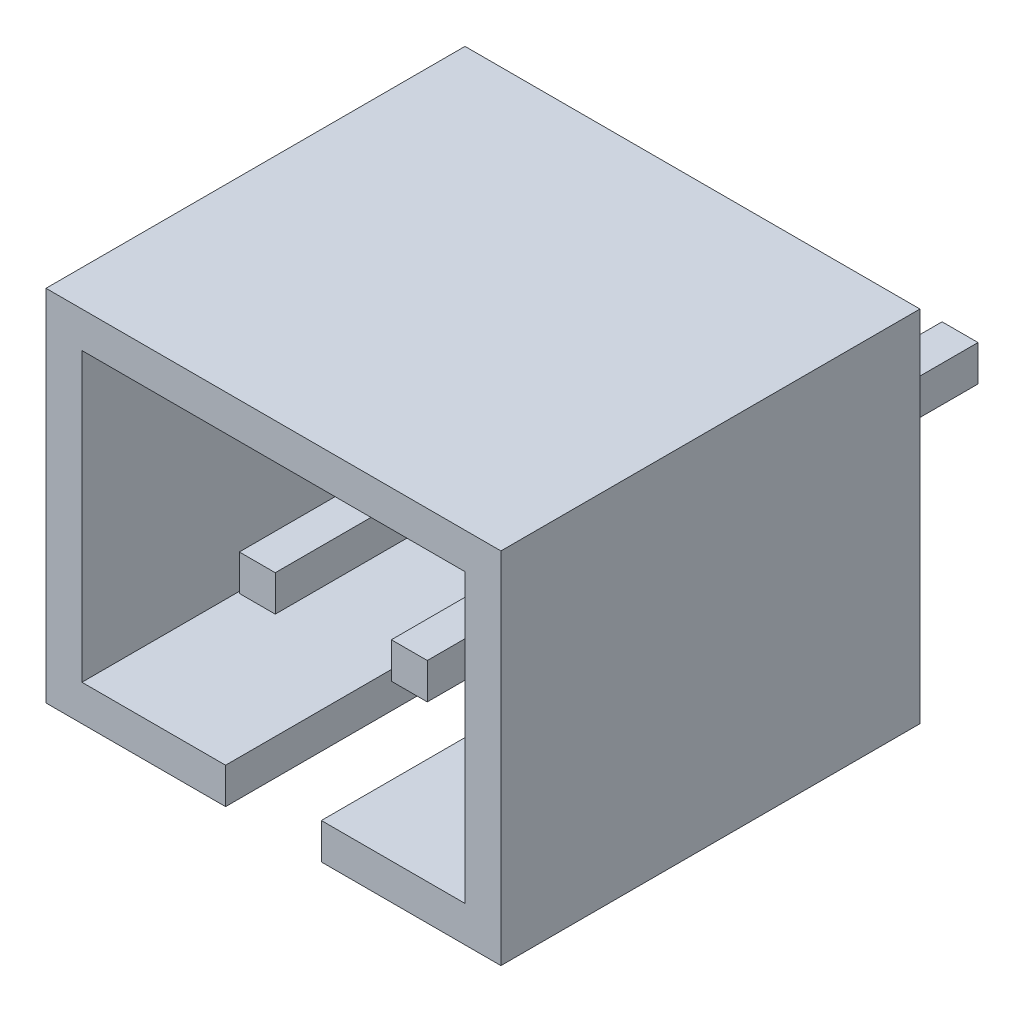
ISO-10303-21;
HEADER;
FILE_DESCRIPTION(('STEP AP214'),'2;1');
FILE_NAME('part.step','',(''),(''),'','','');
FILE_SCHEMA(('AUTOMOTIVE_DESIGN { 1 0 10303 214 1 1 1 1 }'));
ENDSEC;
DATA;
#1=APPLICATION_CONTEXT('core data for automotive mechanical design processes');
#2=APPLICATION_PROTOCOL_DEFINITION('international standard','automotive_design',2000,#1);
#3=PRODUCT_CONTEXT('',#1,'mechanical');
#4=PRODUCT('Part','Part','',(#3));
#5=PRODUCT_RELATED_PRODUCT_CATEGORY('part','',(#4));
#6=PRODUCT_DEFINITION_FORMATION('','',#4);
#7=PRODUCT_DEFINITION_CONTEXT('part definition',#1,'design');
#8=PRODUCT_DEFINITION('design','',#6,#7);
#9=PRODUCT_DEFINITION_SHAPE('','',#8);
#10=(LENGTH_UNIT() NAMED_UNIT(*) SI_UNIT(.MILLI.,.METRE.));
#11=(NAMED_UNIT(*) PLANE_ANGLE_UNIT() SI_UNIT($,.RADIAN.));
#12=(NAMED_UNIT(*) SI_UNIT($,.STERADIAN.) SOLID_ANGLE_UNIT());
#13=UNCERTAINTY_MEASURE_WITH_UNIT(LENGTH_MEASURE(1.E-05),#10,'distance_accuracy_value','');
#14=(GEOMETRIC_REPRESENTATION_CONTEXT(3) GLOBAL_UNCERTAINTY_ASSIGNED_CONTEXT((#13)) GLOBAL_UNIT_ASSIGNED_CONTEXT((#10,
#11,#12)) REPRESENTATION_CONTEXT('',''));
#15=CARTESIAN_POINT('',(0.,0.,0.));
#16=DIRECTION('',(0.,0.,1.));
#17=DIRECTION('',(1.,0.,0.));
#18=AXIS2_PLACEMENT_3D('',#15,#16,#17);
#19=CARTESIAN_POINT('',(3.8,3.,1.8));
#20=DIRECTION('',(-1.,0.,0.));
#21=DIRECTION('',(0.,-1.,0.));
#22=AXIS2_PLACEMENT_3D('',#19,#20,#21);
#23=PLANE('',#22);
#24=DIRECTION('',(0.,1.,0.));
#25=VECTOR('',#24,1.);
#26=CARTESIAN_POINT('',(3.8,3.,0.));
#27=LINE('',#26,#25);
#28=CARTESIAN_POINT('',(3.8,-3.,0.));
#29=VERTEX_POINT('',#28);
#30=CARTESIAN_POINT('',(3.8,3.,0.));
#31=VERTEX_POINT('',#30);
#32=EDGE_CURVE('E359',#29,#31,#27,.T.);
#33=ORIENTED_EDGE('',*,*,#32,.T.);
#34=DIRECTION('',(0.,0.,-1.));
#35=VECTOR('',#34,1.);
#36=CARTESIAN_POINT('',(3.8,3.,1.8));
#37=LINE('',#36,#35);
#38=CARTESIAN_POINT('',(3.8,3.,7.));
#39=VERTEX_POINT('',#38);
#40=EDGE_CURVE('E428',#39,#31,#37,.T.);
#41=ORIENTED_EDGE('',*,*,#40,.F.);
#42=DIRECTION('',(0.,1.,0.));
#43=VECTOR('',#42,1.);
#44=CARTESIAN_POINT('',(3.8,-3.,7.));
#45=LINE('',#44,#43);
#46=CARTESIAN_POINT('',(3.8,-3.,7.));
#47=VERTEX_POINT('',#46);
#48=EDGE_CURVE('E360',#47,#39,#45,.T.);
#49=ORIENTED_EDGE('',*,*,#48,.F.);
#50=DIRECTION('',(0.,0.,-1.));
#51=VECTOR('',#50,1.);
#52=CARTESIAN_POINT('',(3.8,-3.,1.8));
#53=LINE('',#52,#51);
#54=EDGE_CURVE('E411',#47,#29,#53,.T.);
#55=ORIENTED_EDGE('',*,*,#54,.T.);
#56=EDGE_LOOP('',(#33,#41,#49,#55));
#57=FACE_BOUND('',#56,.T.);
#58=ADVANCED_FACE('F37',(#57),#23,.F.);
#59=CARTESIAN_POINT('',(-3.8,3.,1.8));
#60=DIRECTION('',(0.,-1.,0.));
#61=DIRECTION('',(0.,0.,-1.));
#62=AXIS2_PLACEMENT_3D('',#59,#60,#61);
#63=PLANE('',#62);
#64=DIRECTION('',(-1.,0.,0.));
#65=VECTOR('',#64,1.);
#66=CARTESIAN_POINT('',(-3.8,3.,0.));
#67=LINE('',#66,#65);
#68=CARTESIAN_POINT('',(-3.8,3.,0.));
#69=VERTEX_POINT('',#68);
#70=EDGE_CURVE('E415',#31,#69,#67,.T.);
#71=ORIENTED_EDGE('',*,*,#70,.T.);
#72=DIRECTION('',(0.,0.,-1.));
#73=VECTOR('',#72,1.);
#74=CARTESIAN_POINT('',(-3.8,3.,1.8));
#75=LINE('',#74,#73);
#76=CARTESIAN_POINT('',(-3.8,3.,7.));
#77=VERTEX_POINT('',#76);
#78=EDGE_CURVE('E425',#77,#69,#75,.T.);
#79=ORIENTED_EDGE('',*,*,#78,.F.);
#80=DIRECTION('',(-1.,0.,0.));
#81=VECTOR('',#80,1.);
#82=CARTESIAN_POINT('',(-3.8,3.,7.));
#83=LINE('',#82,#81);
#84=EDGE_CURVE('E356',#39,#77,#83,.T.);
#85=ORIENTED_EDGE('',*,*,#84,.F.);
#86=ORIENTED_EDGE('',*,*,#40,.T.);
#87=EDGE_LOOP('',(#71,#79,#85,#86));
#88=FACE_BOUND('',#87,.T.);
#89=ADVANCED_FACE('F481',(#88),#63,.F.);
#90=CARTESIAN_POINT('',(-3.8,3.,1.8));
#91=DIRECTION('',(1.,0.,0.));
#92=DIRECTION('',(0.,1.,0.));
#93=AXIS2_PLACEMENT_3D('',#90,#91,#92);
#94=PLANE('',#93);
#95=DIRECTION('',(0.,-1.,0.));
#96=VECTOR('',#95,1.);
#97=CARTESIAN_POINT('',(-3.8,3.,0.));
#98=LINE('',#97,#96);
#99=CARTESIAN_POINT('',(-3.8,-3.,0.));
#100=VERTEX_POINT('',#99);
#101=EDGE_CURVE('E417',#69,#100,#98,.T.);
#102=ORIENTED_EDGE('',*,*,#101,.T.);
#103=DIRECTION('',(0.,0.,-1.));
#104=VECTOR('',#103,1.);
#105=CARTESIAN_POINT('',(-3.8,-3.,1.8));
#106=LINE('',#105,#104);
#107=CARTESIAN_POINT('',(-3.8,-3.,7.));
#108=VERTEX_POINT('',#107);
#109=EDGE_CURVE('E422',#108,#100,#106,.T.);
#110=ORIENTED_EDGE('',*,*,#109,.F.);
#111=DIRECTION('',(0.,-1.,0.));
#112=VECTOR('',#111,1.);
#113=CARTESIAN_POINT('',(-3.8,-3.,7.));
#114=LINE('',#113,#112);
#115=EDGE_CURVE('E390',#77,#108,#114,.T.);
#116=ORIENTED_EDGE('',*,*,#115,.F.);
#117=ORIENTED_EDGE('',*,*,#78,.T.);
#118=EDGE_LOOP('',(#102,#110,#116,#117));
#119=FACE_BOUND('',#118,.T.);
#120=ADVANCED_FACE('F486',(#119),#94,.F.);
#121=CARTESIAN_POINT('',(-3.8,-3.,1.8));
#122=DIRECTION('',(0.,1.,0.));
#123=DIRECTION('',(0.,0.,1.));
#124=AXIS2_PLACEMENT_3D('',#121,#122,#123);
#125=PLANE('',#124);
#126=DIRECTION('',(1.,0.,0.));
#127=VECTOR('',#126,1.);
#128=CARTESIAN_POINT('',(-3.8,-3.,0.));
#129=LINE('',#128,#127);
#130=EDGE_CURVE('E412',#100,#29,#129,.T.);
#131=ORIENTED_EDGE('',*,*,#130,.T.);
#132=ORIENTED_EDGE('',*,*,#54,.F.);
#133=DIRECTION('',(1.,0.,0.));
#134=VECTOR('',#133,1.);
#135=CARTESIAN_POINT('',(0.800000000000001,-3.,7.));
#136=LINE('',#135,#134);
#137=CARTESIAN_POINT('',(0.800000000000001,-3.,7.));
#138=VERTEX_POINT('',#137);
#139=EDGE_CURVE('E363',#138,#47,#136,.T.);
#140=ORIENTED_EDGE('',*,*,#139,.F.);
#141=DIRECTION('',(0.,0.,-1.));
#142=VECTOR('',#141,1.);
#143=CARTESIAN_POINT('',(0.800000000000001,-3.,23.6829747495282));
#144=LINE('',#143,#142);
#145=CARTESIAN_POINT('',(0.799999999999999,-3.,1.8));
#146=VERTEX_POINT('',#145);
#147=EDGE_CURVE('E331',#138,#146,#144,.T.);
#148=ORIENTED_EDGE('',*,*,#147,.T.);
#149=DIRECTION('',(1.,0.,0.));
#150=VECTOR('',#149,1.);
#151=CARTESIAN_POINT('',(-3.8,-3.,1.8));
#152=LINE('',#151,#150);
#153=CARTESIAN_POINT('',(-0.8,-3.,1.8));
#154=VERTEX_POINT('',#153);
#155=EDGE_CURVE('E409',#154,#146,#152,.T.);
#156=ORIENTED_EDGE('',*,*,#155,.F.);
#157=DIRECTION('',(0.,0.,-1.));
#158=VECTOR('',#157,1.);
#159=CARTESIAN_POINT('',(-0.799999999999999,-3.,23.6829747495282));
#160=LINE('',#159,#158);
#161=CARTESIAN_POINT('',(-0.799999999999999,-3.,7.));
#162=VERTEX_POINT('',#161);
#163=EDGE_CURVE('E327',#162,#154,#160,.T.);
#164=ORIENTED_EDGE('',*,*,#163,.F.);
#165=DIRECTION('',(1.,0.,0.));
#166=VECTOR('',#165,1.);
#167=CARTESIAN_POINT('',(-0.799999999999999,-3.,7.));
#168=LINE('',#167,#166);
#169=EDGE_CURVE('E387',#108,#162,#168,.T.);
#170=ORIENTED_EDGE('',*,*,#169,.F.);
#171=ORIENTED_EDGE('',*,*,#109,.T.);
#172=EDGE_LOOP('',(#131,#132,#140,#148,#156,#164,#170,#171));
#173=FACE_BOUND('',#172,.T.);
#174=ADVANCED_FACE('F499',(#173),#125,.F.);
#175=CARTESIAN_POINT('',(0.,0.,1.8));
#176=DIRECTION('',(0.,0.,1.));
#177=DIRECTION('',(1.,0.,0.));
#178=AXIS2_PLACEMENT_3D('',#175,#176,#177);
#179=PLANE('',#178);
#180=DIRECTION('',(0.,-1.,0.));
#181=VECTOR('',#180,1.);
#182=CARTESIAN_POINT('',(0.97,0.,1.8));
#183=LINE('',#182,#181);
#184=CARTESIAN_POINT('',(0.97,-0.2,1.8));
#185=VERTEX_POINT('',#184);
#186=CARTESIAN_POINT('',(0.97,-0.8,1.8));
#187=VERTEX_POINT('',#186);
#188=EDGE_CURVE('E51',#185,#187,#183,.T.);
#189=ORIENTED_EDGE('',*,*,#188,.F.);
#190=DIRECTION('',(-1.,0.,0.));
#191=VECTOR('',#190,1.);
#192=CARTESIAN_POINT('',(0.,-0.2,1.8));
#193=LINE('',#192,#191);
#194=CARTESIAN_POINT('',(1.57,-0.2,1.8));
#195=VERTEX_POINT('',#194);
#196=EDGE_CURVE('E55',#195,#185,#193,.T.);
#197=ORIENTED_EDGE('',*,*,#196,.F.);
#198=DIRECTION('',(0.,1.,0.));
#199=VECTOR('',#198,1.);
#200=CARTESIAN_POINT('',(1.57,0.,1.8));
#201=LINE('',#200,#199);
#202=CARTESIAN_POINT('',(1.57,-0.8,1.8));
#203=VERTEX_POINT('',#202);
#204=EDGE_CURVE('E226',#203,#195,#201,.T.);
#205=ORIENTED_EDGE('',*,*,#204,.F.);
#206=DIRECTION('',(1.,0.,0.));
#207=VECTOR('',#206,1.);
#208=CARTESIAN_POINT('',(0.,-0.8,1.8));
#209=LINE('',#208,#207);
#210=EDGE_CURVE('E263',#187,#203,#209,.T.);
#211=ORIENTED_EDGE('',*,*,#210,.F.);
#212=EDGE_LOOP('',(#189,#197,#205,#211));
#213=FACE_BOUND('',#212,.T.);
#214=DIRECTION('',(0.,-1.,0.));
#215=VECTOR('',#214,1.);
#216=CARTESIAN_POINT('',(-1.57,0.,1.8));
#217=LINE('',#216,#215);
#218=CARTESIAN_POINT('',(-1.57,-0.2,1.8));
#219=VERTEX_POINT('',#218);
#220=CARTESIAN_POINT('',(-1.57,-0.8,1.8));
#221=VERTEX_POINT('',#220);
#222=EDGE_CURVE('E324',#219,#221,#217,.T.);
#223=ORIENTED_EDGE('',*,*,#222,.F.);
#224=DIRECTION('',(-1.,0.,0.));
#225=VECTOR('',#224,1.);
#226=CARTESIAN_POINT('',(0.,-0.2,1.8));
#227=LINE('',#226,#225);
#228=CARTESIAN_POINT('',(-0.970000000000001,-0.2,1.8));
#229=VERTEX_POINT('',#228);
#230=EDGE_CURVE('E321',#229,#219,#227,.T.);
#231=ORIENTED_EDGE('',*,*,#230,.F.);
#232=DIRECTION('',(0.,1.,0.));
#233=VECTOR('',#232,1.);
#234=CARTESIAN_POINT('',(-0.970000000000001,0.,1.8));
#235=LINE('',#234,#233);
#236=CARTESIAN_POINT('',(-0.97,-0.8,1.8));
#237=VERTEX_POINT('',#236);
#238=EDGE_CURVE('E318',#237,#229,#235,.T.);
#239=ORIENTED_EDGE('',*,*,#238,.F.);
#240=DIRECTION('',(1.,0.,0.));
#241=VECTOR('',#240,1.);
#242=CARTESIAN_POINT('',(0.,-0.8,1.8));
#243=LINE('',#242,#241);
#244=EDGE_CURVE('E304',#221,#237,#243,.T.);
#245=ORIENTED_EDGE('',*,*,#244,.F.);
#246=EDGE_LOOP('',(#223,#231,#239,#245));
#247=FACE_BOUND('',#246,.T.);
#248=DIRECTION('',(0.,-1.,0.));
#249=VECTOR('',#248,1.);
#250=CARTESIAN_POINT('',(0.800000000000001,-3.,1.8));
#251=LINE('',#250,#249);
#252=CARTESIAN_POINT('',(0.800000000000001,-2.4,1.8));
#253=VERTEX_POINT('',#252);
#254=EDGE_CURVE('E328',#253,#146,#251,.T.);
#255=ORIENTED_EDGE('',*,*,#254,.F.);
#256=DIRECTION('',(-1.,0.,0.));
#257=VECTOR('',#256,1.);
#258=CARTESIAN_POINT('',(0.800000000000001,-2.4,1.8));
#259=LINE('',#258,#257);
#260=CARTESIAN_POINT('',(3.2,-2.4,1.8));
#261=VERTEX_POINT('',#260);
#262=EDGE_CURVE('E333',#261,#253,#259,.T.);
#263=ORIENTED_EDGE('',*,*,#262,.F.);
#264=DIRECTION('',(0.,-1.,0.));
#265=VECTOR('',#264,1.);
#266=CARTESIAN_POINT('',(3.2,-2.4,1.8));
#267=LINE('',#266,#265);
#268=CARTESIAN_POINT('',(3.2,2.4,1.8));
#269=VERTEX_POINT('',#268);
#270=EDGE_CURVE('E337',#269,#261,#267,.T.);
#271=ORIENTED_EDGE('',*,*,#270,.F.);
#272=DIRECTION('',(1.,0.,0.));
#273=VECTOR('',#272,1.);
#274=CARTESIAN_POINT('',(-3.2,2.4,1.8));
#275=LINE('',#274,#273);
#276=CARTESIAN_POINT('',(-3.2,2.4,1.8));
#277=VERTEX_POINT('',#276);
#278=EDGE_CURVE('E341',#277,#269,#275,.T.);
#279=ORIENTED_EDGE('',*,*,#278,.F.);
#280=DIRECTION('',(0.,1.,0.));
#281=VECTOR('',#280,1.);
#282=CARTESIAN_POINT('',(-3.2,-2.4,1.8));
#283=LINE('',#282,#281);
#284=CARTESIAN_POINT('',(-3.2,-2.4,1.8));
#285=VERTEX_POINT('',#284);
#286=EDGE_CURVE('E345',#285,#277,#283,.T.);
#287=ORIENTED_EDGE('',*,*,#286,.F.);
#288=DIRECTION('',(-1.,0.,0.));
#289=VECTOR('',#288,1.);
#290=CARTESIAN_POINT('',(-0.799999999999999,-2.4,1.8));
#291=LINE('',#290,#289);
#292=CARTESIAN_POINT('',(-0.799999999999999,-2.4,1.8));
#293=VERTEX_POINT('',#292);
#294=EDGE_CURVE('E349',#293,#285,#291,.T.);
#295=ORIENTED_EDGE('',*,*,#294,.F.);
#296=DIRECTION('',(0.,1.,0.));
#297=VECTOR('',#296,1.);
#298=CARTESIAN_POINT('',(-0.799999999999999,-3.,1.8));
#299=LINE('',#298,#297);
#300=EDGE_CURVE('E353',#154,#293,#299,.T.);
#301=ORIENTED_EDGE('',*,*,#300,.F.);
#302=ORIENTED_EDGE('',*,*,#155,.T.);
#303=EDGE_LOOP('',(#255,#263,#271,#279,#287,#295,#301,#302));
#304=FACE_BOUND('',#303,.T.);
#305=ADVANCED_FACE('F505',(#213,#247,#304),#179,.T.);
#306=CARTESIAN_POINT('',(0.,0.,0.));
#307=DIRECTION('',(0.,0.,1.));
#308=DIRECTION('',(1.,0.,0.));
#309=AXIS2_PLACEMENT_3D('',#306,#307,#308);
#310=PLANE('',#309);
#311=DIRECTION('',(-1.,0.,0.));
#312=VECTOR('',#311,1.);
#313=CARTESIAN_POINT('',(0.,-0.2,0.));
#314=LINE('',#313,#312);
#315=CARTESIAN_POINT('',(1.57,-0.2,0.));
#316=VERTEX_POINT('',#315);
#317=CARTESIAN_POINT('',(0.97,-0.2,0.));
#318=VERTEX_POINT('',#317);
#319=EDGE_CURVE('E44',#316,#318,#314,.T.);
#320=ORIENTED_EDGE('',*,*,#319,.T.);
#321=DIRECTION('',(0.,-1.,0.));
#322=VECTOR('',#321,1.);
#323=CARTESIAN_POINT('',(0.97,0.,0.));
#324=LINE('',#323,#322);
#325=CARTESIAN_POINT('',(0.97,-0.8,0.));
#326=VERTEX_POINT('',#325);
#327=EDGE_CURVE('E12',#318,#326,#324,.T.);
#328=ORIENTED_EDGE('',*,*,#327,.T.);
#329=DIRECTION('',(1.,0.,0.));
#330=VECTOR('',#329,1.);
#331=CARTESIAN_POINT('',(0.,-0.8,0.));
#332=LINE('',#331,#330);
#333=CARTESIAN_POINT('',(1.57,-0.8,0.));
#334=VERTEX_POINT('',#333);
#335=EDGE_CURVE('E443',#326,#334,#332,.T.);
#336=ORIENTED_EDGE('',*,*,#335,.T.);
#337=DIRECTION('',(0.,1.,0.));
#338=VECTOR('',#337,1.);
#339=CARTESIAN_POINT('',(1.57,0.,0.));
#340=LINE('',#339,#338);
#341=EDGE_CURVE('E446',#334,#316,#340,.T.);
#342=ORIENTED_EDGE('',*,*,#341,.T.);
#343=EDGE_LOOP('',(#320,#328,#336,#342));
#344=FACE_BOUND('',#343,.T.);
#345=DIRECTION('',(-1.,0.,0.));
#346=VECTOR('',#345,1.);
#347=CARTESIAN_POINT('',(0.,-0.2,0.));
#348=LINE('',#347,#346);
#349=CARTESIAN_POINT('',(-0.970000000000001,-0.2,0.));
#350=VERTEX_POINT('',#349);
#351=CARTESIAN_POINT('',(-1.57,-0.2,0.));
#352=VERTEX_POINT('',#351);
#353=EDGE_CURVE('E437',#350,#352,#348,.T.);
#354=ORIENTED_EDGE('',*,*,#353,.T.);
#355=DIRECTION('',(0.,-1.,0.));
#356=VECTOR('',#355,1.);
#357=CARTESIAN_POINT('',(-1.57,0.,0.));
#358=LINE('',#357,#356);
#359=CARTESIAN_POINT('',(-1.57,-0.8,0.));
#360=VERTEX_POINT('',#359);
#361=EDGE_CURVE('E440',#352,#360,#358,.T.);
#362=ORIENTED_EDGE('',*,*,#361,.T.);
#363=DIRECTION('',(1.,0.,0.));
#364=VECTOR('',#363,1.);
#365=CARTESIAN_POINT('',(0.,-0.8,0.));
#366=LINE('',#365,#364);
#367=CARTESIAN_POINT('',(-0.97,-0.8,0.));
#368=VERTEX_POINT('',#367);
#369=EDGE_CURVE('E431',#360,#368,#366,.T.);
#370=ORIENTED_EDGE('',*,*,#369,.T.);
#371=DIRECTION('',(0.,1.,0.));
#372=VECTOR('',#371,1.);
#373=CARTESIAN_POINT('',(-0.970000000000001,0.,0.));
#374=LINE('',#373,#372);
#375=EDGE_CURVE('E434',#368,#350,#374,.T.);
#376=ORIENTED_EDGE('',*,*,#375,.T.);
#377=EDGE_LOOP('',(#354,#362,#370,#376));
#378=FACE_BOUND('',#377,.T.);
#379=ORIENTED_EDGE('',*,*,#32,.F.);
#380=ORIENTED_EDGE('',*,*,#130,.F.);
#381=ORIENTED_EDGE('',*,*,#101,.F.);
#382=ORIENTED_EDGE('',*,*,#70,.F.);
#383=EDGE_LOOP('',(#379,#380,#381,#382));
#384=FACE_BOUND('',#383,.T.);
#385=ADVANCED_FACE('F450',(#344,#378,#384),#310,.F.);
#386=CARTESIAN_POINT('',(-0.799999999999999,-3.,23.6829747495282));
#387=DIRECTION('',(-1.,0.,0.));
#388=DIRECTION('',(0.,0.,1.));
#389=AXIS2_PLACEMENT_3D('',#386,#387,#388);
#390=PLANE('',#389);
#391=DIRECTION('',(0.,1.,0.));
#392=VECTOR('',#391,1.);
#393=CARTESIAN_POINT('',(-0.799999999999999,-3.,7.));
#394=LINE('',#393,#392);
#395=CARTESIAN_POINT('',(-0.799999999999999,-2.4,7.));
#396=VERTEX_POINT('',#395);
#397=EDGE_CURVE('E384',#162,#396,#394,.T.);
#398=ORIENTED_EDGE('',*,*,#397,.F.);
#399=ORIENTED_EDGE('',*,*,#163,.T.);
#400=ORIENTED_EDGE('',*,*,#300,.T.);
#401=DIRECTION('',(0.,0.,-1.));
#402=VECTOR('',#401,1.);
#403=CARTESIAN_POINT('',(-0.799999999999999,-2.4,23.6829747495282));
#404=LINE('',#403,#402);
#405=EDGE_CURVE('E352',#396,#293,#404,.T.);
#406=ORIENTED_EDGE('',*,*,#405,.F.);
#407=EDGE_LOOP('',(#398,#399,#400,#406));
#408=FACE_BOUND('',#407,.T.);
#409=ADVANCED_FACE('F509',(#408),#390,.F.);
#410=CARTESIAN_POINT('',(-0.799999999999999,-2.4,23.6829747495282));
#411=DIRECTION('',(0.,-1.,0.));
#412=DIRECTION('',(1.,0.,0.));
#413=AXIS2_PLACEMENT_3D('',#410,#411,#412);
#414=PLANE('',#413);
#415=DIRECTION('',(-1.,0.,0.));
#416=VECTOR('',#415,1.);
#417=CARTESIAN_POINT('',(-0.799999999999999,-2.4,7.));
#418=LINE('',#417,#416);
#419=CARTESIAN_POINT('',(-3.2,-2.4,7.));
#420=VERTEX_POINT('',#419);
#421=EDGE_CURVE('E381',#396,#420,#418,.T.);
#422=ORIENTED_EDGE('',*,*,#421,.F.);
#423=ORIENTED_EDGE('',*,*,#405,.T.);
#424=ORIENTED_EDGE('',*,*,#294,.T.);
#425=DIRECTION('',(0.,0.,-1.));
#426=VECTOR('',#425,1.);
#427=CARTESIAN_POINT('',(-3.2,-2.4,23.6829747495282));
#428=LINE('',#427,#426);
#429=EDGE_CURVE('E348',#420,#285,#428,.T.);
#430=ORIENTED_EDGE('',*,*,#429,.F.);
#431=EDGE_LOOP('',(#422,#423,#424,#430));
#432=FACE_BOUND('',#431,.T.);
#433=ADVANCED_FACE('F528',(#432),#414,.F.);
#434=CARTESIAN_POINT('',(-3.2,-2.4,23.6829747495282));
#435=DIRECTION('',(-1.,0.,0.));
#436=DIRECTION('',(0.,0.,1.));
#437=AXIS2_PLACEMENT_3D('',#434,#435,#436);
#438=PLANE('',#437);
#439=DIRECTION('',(0.,1.,0.));
#440=VECTOR('',#439,1.);
#441=CARTESIAN_POINT('',(-3.2,-2.4,7.));
#442=LINE('',#441,#440);
#443=CARTESIAN_POINT('',(-3.2,2.4,7.));
#444=VERTEX_POINT('',#443);
#445=EDGE_CURVE('E378',#420,#444,#442,.T.);
#446=ORIENTED_EDGE('',*,*,#445,.F.);
#447=ORIENTED_EDGE('',*,*,#429,.T.);
#448=ORIENTED_EDGE('',*,*,#286,.T.);
#449=DIRECTION('',(0.,0.,-1.));
#450=VECTOR('',#449,1.);
#451=CARTESIAN_POINT('',(-3.2,2.4,23.6829747495282));
#452=LINE('',#451,#450);
#453=EDGE_CURVE('E344',#444,#277,#452,.T.);
#454=ORIENTED_EDGE('',*,*,#453,.F.);
#455=EDGE_LOOP('',(#446,#447,#448,#454));
#456=FACE_BOUND('',#455,.T.);
#457=ADVANCED_FACE('F531',(#456),#438,.F.);
#458=CARTESIAN_POINT('',(-3.2,2.4,23.6829747495282));
#459=DIRECTION('',(0.,1.,0.));
#460=DIRECTION('',(-1.,0.,0.));
#461=AXIS2_PLACEMENT_3D('',#458,#459,#460);
#462=PLANE('',#461);
#463=DIRECTION('',(1.,0.,0.));
#464=VECTOR('',#463,1.);
#465=CARTESIAN_POINT('',(-3.2,2.4,7.));
#466=LINE('',#465,#464);
#467=CARTESIAN_POINT('',(3.2,2.4,7.));
#468=VERTEX_POINT('',#467);
#469=EDGE_CURVE('E375',#444,#468,#466,.T.);
#470=ORIENTED_EDGE('',*,*,#469,.F.);
#471=ORIENTED_EDGE('',*,*,#453,.T.);
#472=ORIENTED_EDGE('',*,*,#278,.T.);
#473=DIRECTION('',(0.,0.,-1.));
#474=VECTOR('',#473,1.);
#475=CARTESIAN_POINT('',(3.2,2.4,23.6829747495282));
#476=LINE('',#475,#474);
#477=EDGE_CURVE('E340',#468,#269,#476,.T.);
#478=ORIENTED_EDGE('',*,*,#477,.F.);
#479=EDGE_LOOP('',(#470,#471,#472,#478));
#480=FACE_BOUND('',#479,.T.);
#481=ADVANCED_FACE('F535',(#480),#462,.F.);
#482=CARTESIAN_POINT('',(3.2,-2.4,23.6829747495282));
#483=DIRECTION('',(1.,0.,0.));
#484=DIRECTION('',(0.,1.,0.));
#485=AXIS2_PLACEMENT_3D('',#482,#483,#484);
#486=PLANE('',#485);
#487=DIRECTION('',(0.,-1.,0.));
#488=VECTOR('',#487,1.);
#489=CARTESIAN_POINT('',(3.2,-2.4,7.));
#490=LINE('',#489,#488);
#491=CARTESIAN_POINT('',(3.2,-2.4,7.));
#492=VERTEX_POINT('',#491);
#493=EDGE_CURVE('E372',#468,#492,#490,.T.);
#494=ORIENTED_EDGE('',*,*,#493,.F.);
#495=ORIENTED_EDGE('',*,*,#477,.T.);
#496=ORIENTED_EDGE('',*,*,#270,.T.);
#497=DIRECTION('',(0.,0.,-1.));
#498=VECTOR('',#497,1.);
#499=CARTESIAN_POINT('',(3.2,-2.4,23.6829747495282));
#500=LINE('',#499,#498);
#501=EDGE_CURVE('E336',#492,#261,#500,.T.);
#502=ORIENTED_EDGE('',*,*,#501,.F.);
#503=EDGE_LOOP('',(#494,#495,#496,#502));
#504=FACE_BOUND('',#503,.T.);
#505=ADVANCED_FACE('F539',(#504),#486,.F.);
#506=CARTESIAN_POINT('',(0.800000000000001,-2.4,23.6829747495282));
#507=DIRECTION('',(0.,-1.,0.));
#508=DIRECTION('',(0.,0.,-1.));
#509=AXIS2_PLACEMENT_3D('',#506,#507,#508);
#510=PLANE('',#509);
#511=DIRECTION('',(-1.,0.,0.));
#512=VECTOR('',#511,1.);
#513=CARTESIAN_POINT('',(0.800000000000001,-2.4,7.));
#514=LINE('',#513,#512);
#515=CARTESIAN_POINT('',(0.800000000000001,-2.4,7.));
#516=VERTEX_POINT('',#515);
#517=EDGE_CURVE('E369',#492,#516,#514,.T.);
#518=ORIENTED_EDGE('',*,*,#517,.F.);
#519=ORIENTED_EDGE('',*,*,#501,.T.);
#520=ORIENTED_EDGE('',*,*,#262,.T.);
#521=DIRECTION('',(0.,0.,-1.));
#522=VECTOR('',#521,1.);
#523=CARTESIAN_POINT('',(0.800000000000001,-2.4,23.6829747495282));
#524=LINE('',#523,#522);
#525=EDGE_CURVE('E332',#516,#253,#524,.T.);
#526=ORIENTED_EDGE('',*,*,#525,.F.);
#527=EDGE_LOOP('',(#518,#519,#520,#526));
#528=FACE_BOUND('',#527,.T.);
#529=ADVANCED_FACE('F543',(#528),#510,.F.);
#530=CARTESIAN_POINT('',(0.800000000000001,-3.,23.6829747495282));
#531=DIRECTION('',(1.,0.,0.));
#532=DIRECTION('',(0.,0.,-1.));
#533=AXIS2_PLACEMENT_3D('',#530,#531,#532);
#534=PLANE('',#533);
#535=DIRECTION('',(0.,-1.,0.));
#536=VECTOR('',#535,1.);
#537=CARTESIAN_POINT('',(0.800000000000001,-3.,7.));
#538=LINE('',#537,#536);
#539=EDGE_CURVE('E366',#516,#138,#538,.T.);
#540=ORIENTED_EDGE('',*,*,#539,.F.);
#541=ORIENTED_EDGE('',*,*,#525,.T.);
#542=ORIENTED_EDGE('',*,*,#254,.T.);
#543=ORIENTED_EDGE('',*,*,#147,.F.);
#544=EDGE_LOOP('',(#540,#541,#542,#543));
#545=FACE_BOUND('',#544,.T.);
#546=ADVANCED_FACE('F502',(#545),#534,.F.);
#547=CARTESIAN_POINT('',(0.,0.,7.));
#548=DIRECTION('',(0.,0.,1.));
#549=DIRECTION('',(1.,0.,0.));
#550=AXIS2_PLACEMENT_3D('',#547,#548,#549);
#551=PLANE('',#550);
#552=ORIENTED_EDGE('',*,*,#115,.T.);
#553=ORIENTED_EDGE('',*,*,#169,.T.);
#554=ORIENTED_EDGE('',*,*,#397,.T.);
#555=ORIENTED_EDGE('',*,*,#421,.T.);
#556=ORIENTED_EDGE('',*,*,#445,.T.);
#557=ORIENTED_EDGE('',*,*,#469,.T.);
#558=ORIENTED_EDGE('',*,*,#493,.T.);
#559=ORIENTED_EDGE('',*,*,#517,.T.);
#560=ORIENTED_EDGE('',*,*,#539,.T.);
#561=ORIENTED_EDGE('',*,*,#139,.T.);
#562=ORIENTED_EDGE('',*,*,#48,.T.);
#563=ORIENTED_EDGE('',*,*,#84,.T.);
#564=EDGE_LOOP('',(#552,#553,#554,#555,#556,#557,#558,#559,#560,#561,#562,#563));
#565=FACE_BOUND('',#564,.T.);
#566=ADVANCED_FACE('F496',(#565),#551,.T.);
#567=CARTESIAN_POINT('',(0.,0.,-3.2));
#568=DIRECTION('',(0.,0.,1.));
#569=DIRECTION('',(1.,0.,0.));
#570=AXIS2_PLACEMENT_3D('',#567,#568,#569);
#571=PLANE('',#570);
#572=DIRECTION('',(0.,-1.,0.));
#573=VECTOR('',#572,1.);
#574=CARTESIAN_POINT('',(-1.57,-0.2,-3.2));
#575=LINE('',#574,#573);
#576=CARTESIAN_POINT('',(-1.57,-0.2,-3.2));
#577=VERTEX_POINT('',#576);
#578=CARTESIAN_POINT('',(-1.57,-0.8,-3.2));
#579=VERTEX_POINT('',#578);
#580=EDGE_CURVE('E280',#577,#579,#575,.T.);
#581=ORIENTED_EDGE('',*,*,#580,.F.);
#582=DIRECTION('',(-1.,0.,0.));
#583=VECTOR('',#582,1.);
#584=CARTESIAN_POINT('',(-1.57,-0.2,-3.2));
#585=LINE('',#584,#583);
#586=CARTESIAN_POINT('',(-0.970000000000001,-0.2,-3.2));
#587=VERTEX_POINT('',#586);
#588=EDGE_CURVE('E297',#587,#577,#585,.T.);
#589=ORIENTED_EDGE('',*,*,#588,.F.);
#590=DIRECTION('',(0.,1.,0.));
#591=VECTOR('',#590,1.);
#592=CARTESIAN_POINT('',(-0.970000000000001,-0.2,-3.2));
#593=LINE('',#592,#591);
#594=CARTESIAN_POINT('',(-0.97,-0.8,-3.2));
#595=VERTEX_POINT('',#594);
#596=EDGE_CURVE('E294',#595,#587,#593,.T.);
#597=ORIENTED_EDGE('',*,*,#596,.F.);
#598=DIRECTION('',(1.,0.,0.));
#599=VECTOR('',#598,1.);
#600=CARTESIAN_POINT('',(-1.57,-0.8,-3.2));
#601=LINE('',#600,#599);
#602=EDGE_CURVE('E291',#579,#595,#601,.T.);
#603=ORIENTED_EDGE('',*,*,#602,.F.);
#604=EDGE_LOOP('',(#581,#589,#597,#603));
#605=FACE_BOUND('',#604,.T.);
#606=ADVANCED_FACE('F525',(#605),#571,.F.);
#607=CARTESIAN_POINT('',(-1.57,-0.8,-3.2));
#608=DIRECTION('',(0.,-1.,0.));
#609=DIRECTION('',(0.,0.,-1.));
#610=AXIS2_PLACEMENT_3D('',#607,#608,#609);
#611=PLANE('',#610);
#612=ORIENTED_EDGE('',*,*,#369,.F.);
#613=DIRECTION('',(0.,0.,1.));
#614=VECTOR('',#613,1.);
#615=CARTESIAN_POINT('',(-1.57,-0.8,-3.2));
#616=LINE('',#615,#614);
#617=EDGE_CURVE('E313',#579,#360,#616,.T.);
#618=ORIENTED_EDGE('',*,*,#617,.F.);
#619=ORIENTED_EDGE('',*,*,#602,.T.);
#620=DIRECTION('',(0.,0.,1.));
#621=VECTOR('',#620,1.);
#622=CARTESIAN_POINT('',(-0.97,-0.8,-3.2));
#623=LINE('',#622,#621);
#624=EDGE_CURVE('E310',#595,#368,#623,.T.);
#625=ORIENTED_EDGE('',*,*,#624,.T.);
#626=EDGE_LOOP('',(#612,#618,#619,#625));
#627=FACE_BOUND('',#626,.T.);
#628=ADVANCED_FACE('F561',(#627),#611,.T.);
#629=CARTESIAN_POINT('',(-0.970000000000001,-0.2,-3.2));
#630=DIRECTION('',(1.,0.,0.));
#631=DIRECTION('',(0.,1.,0.));
#632=AXIS2_PLACEMENT_3D('',#629,#630,#631);
#633=PLANE('',#632);
#634=ORIENTED_EDGE('',*,*,#375,.F.);
#635=ORIENTED_EDGE('',*,*,#624,.F.);
#636=ORIENTED_EDGE('',*,*,#596,.T.);
#637=DIRECTION('',(0.,0.,1.));
#638=VECTOR('',#637,1.);
#639=CARTESIAN_POINT('',(-0.970000000000001,-0.2,-3.2));
#640=LINE('',#639,#638);
#641=EDGE_CURVE('E306',#587,#350,#640,.T.);
#642=ORIENTED_EDGE('',*,*,#641,.T.);
#643=EDGE_LOOP('',(#634,#635,#636,#642));
#644=FACE_BOUND('',#643,.T.);
#645=ADVANCED_FACE('F565',(#644),#633,.T.);
#646=CARTESIAN_POINT('',(-1.57,-0.2,-3.2));
#647=DIRECTION('',(0.,1.,0.));
#648=DIRECTION('',(-1.,0.,0.));
#649=AXIS2_PLACEMENT_3D('',#646,#647,#648);
#650=PLANE('',#649);
#651=ORIENTED_EDGE('',*,*,#353,.F.);
#652=ORIENTED_EDGE('',*,*,#641,.F.);
#653=ORIENTED_EDGE('',*,*,#588,.T.);
#654=DIRECTION('',(0.,0.,1.));
#655=VECTOR('',#654,1.);
#656=CARTESIAN_POINT('',(-1.57,-0.2,-3.2));
#657=LINE('',#656,#655);
#658=EDGE_CURVE('E301',#577,#352,#657,.T.);
#659=ORIENTED_EDGE('',*,*,#658,.T.);
#660=EDGE_LOOP('',(#651,#652,#653,#659));
#661=FACE_BOUND('',#660,.T.);
#662=ADVANCED_FACE('F569',(#661),#650,.T.);
#663=CARTESIAN_POINT('',(-1.57,-0.2,-3.2));
#664=DIRECTION('',(-1.,0.,0.));
#665=DIRECTION('',(0.,0.,1.));
#666=AXIS2_PLACEMENT_3D('',#663,#664,#665);
#667=PLANE('',#666);
#668=ORIENTED_EDGE('',*,*,#361,.F.);
#669=ORIENTED_EDGE('',*,*,#658,.F.);
#670=ORIENTED_EDGE('',*,*,#580,.T.);
#671=ORIENTED_EDGE('',*,*,#617,.T.);
#672=EDGE_LOOP('',(#668,#669,#670,#671));
#673=FACE_BOUND('',#672,.T.);
#674=ADVANCED_FACE('F554',(#673),#667,.T.);
#675=CARTESIAN_POINT('',(-1.57,-0.2,6.));
#676=VERTEX_POINT('',#675);
#677=EDGE_CURVE('E305',#219,#676,#657,.T.);
#678=ORIENTED_EDGE('',*,*,#677,.F.);
#679=ORIENTED_EDGE('',*,*,#222,.T.);
#680=CARTESIAN_POINT('',(-1.57,-0.8,6.));
#681=VERTEX_POINT('',#680);
#682=EDGE_CURVE('E300',#221,#681,#616,.T.);
#683=ORIENTED_EDGE('',*,*,#682,.T.);
#684=DIRECTION('',(0.,-1.,0.));
#685=VECTOR('',#684,1.);
#686=CARTESIAN_POINT('',(-1.57,-0.2,6.));
#687=LINE('',#686,#685);
#688=EDGE_CURVE('E284',#676,#681,#687,.T.);
#689=ORIENTED_EDGE('',*,*,#688,.F.);
#690=EDGE_LOOP('',(#678,#679,#683,#689));
#691=FACE_BOUND('',#690,.T.);
#692=ADVANCED_FACE('F550',(#691),#667,.T.);
#693=CARTESIAN_POINT('',(-0.970000000000001,-0.2,6.));
#694=VERTEX_POINT('',#693);
#695=EDGE_CURVE('E309',#229,#694,#640,.T.);
#696=ORIENTED_EDGE('',*,*,#695,.F.);
#697=ORIENTED_EDGE('',*,*,#230,.T.);
#698=ORIENTED_EDGE('',*,*,#677,.T.);
#699=DIRECTION('',(-1.,0.,0.));
#700=VECTOR('',#699,1.);
#701=CARTESIAN_POINT('',(-1.57,-0.2,6.));
#702=LINE('',#701,#700);
#703=EDGE_CURVE('E276',#694,#676,#702,.T.);
#704=ORIENTED_EDGE('',*,*,#703,.F.);
#705=EDGE_LOOP('',(#696,#697,#698,#704));
#706=FACE_BOUND('',#705,.T.);
#707=ADVANCED_FACE('F553',(#706),#650,.T.);
#708=CARTESIAN_POINT('',(-0.97,-0.8,6.));
#709=VERTEX_POINT('',#708);
#710=EDGE_CURVE('E312',#237,#709,#623,.T.);
#711=ORIENTED_EDGE('',*,*,#710,.F.);
#712=ORIENTED_EDGE('',*,*,#238,.T.);
#713=ORIENTED_EDGE('',*,*,#695,.T.);
#714=DIRECTION('',(0.,1.,0.));
#715=VECTOR('',#714,1.);
#716=CARTESIAN_POINT('',(-0.970000000000001,-0.2,6.));
#717=LINE('',#716,#715);
#718=EDGE_CURVE('E277',#709,#694,#717,.T.);
#719=ORIENTED_EDGE('',*,*,#718,.F.);
#720=EDGE_LOOP('',(#711,#712,#713,#719));
#721=FACE_BOUND('',#720,.T.);
#722=ADVANCED_FACE('F559',(#721),#633,.T.);
#723=ORIENTED_EDGE('',*,*,#682,.F.);
#724=ORIENTED_EDGE('',*,*,#244,.T.);
#725=ORIENTED_EDGE('',*,*,#710,.T.);
#726=DIRECTION('',(1.,0.,0.));
#727=VECTOR('',#726,1.);
#728=CARTESIAN_POINT('',(-1.57,-0.8,6.));
#729=LINE('',#728,#727);
#730=EDGE_CURVE('E281',#681,#709,#729,.T.);
#731=ORIENTED_EDGE('',*,*,#730,.F.);
#732=EDGE_LOOP('',(#723,#724,#725,#731));
#733=FACE_BOUND('',#732,.T.);
#734=ADVANCED_FACE('F556',(#733),#611,.T.);
#735=CARTESIAN_POINT('',(0.,0.,6.));
#736=DIRECTION('',(0.,0.,1.));
#737=DIRECTION('',(1.,0.,0.));
#738=AXIS2_PLACEMENT_3D('',#735,#736,#737);
#739=PLANE('',#738);
#740=ORIENTED_EDGE('',*,*,#703,.T.);
#741=ORIENTED_EDGE('',*,*,#688,.T.);
#742=ORIENTED_EDGE('',*,*,#730,.T.);
#743=ORIENTED_EDGE('',*,*,#718,.T.);
#744=EDGE_LOOP('',(#740,#741,#742,#743));
#745=FACE_BOUND('',#744,.T.);
#746=ADVANCED_FACE('F475',(#745),#739,.T.);
#747=CARTESIAN_POINT('',(2.54,0.,-3.2));
#748=DIRECTION('',(0.,0.,1.));
#749=DIRECTION('',(1.,0.,0.));
#750=AXIS2_PLACEMENT_3D('',#747,#748,#749);
#751=PLANE('',#750);
#752=DIRECTION('',(0.,-1.,0.));
#753=VECTOR('',#752,1.);
#754=CARTESIAN_POINT('',(0.97,-0.2,-3.2));
#755=LINE('',#754,#753);
#756=CARTESIAN_POINT('',(0.97,-0.2,-3.2));
#757=VERTEX_POINT('',#756);
#758=CARTESIAN_POINT('',(0.97,-0.8,-3.2));
#759=VERTEX_POINT('',#758);
#760=EDGE_CURVE('E244',#757,#759,#755,.T.);
#761=ORIENTED_EDGE('',*,*,#760,.F.);
#762=DIRECTION('',(-1.,0.,0.));
#763=VECTOR('',#762,1.);
#764=CARTESIAN_POINT('',(0.97,-0.2,-3.2));
#765=LINE('',#764,#763);
#766=CARTESIAN_POINT('',(1.57,-0.2,-3.2));
#767=VERTEX_POINT('',#766);
#768=EDGE_CURVE('E257',#767,#757,#765,.T.);
#769=ORIENTED_EDGE('',*,*,#768,.F.);
#770=DIRECTION('',(0.,1.,0.));
#771=VECTOR('',#770,1.);
#772=CARTESIAN_POINT('',(1.57,-0.2,-3.2));
#773=LINE('',#772,#771);
#774=CARTESIAN_POINT('',(1.57,-0.8,-3.2));
#775=VERTEX_POINT('',#774);
#776=EDGE_CURVE('E254',#775,#767,#773,.T.);
#777=ORIENTED_EDGE('',*,*,#776,.F.);
#778=DIRECTION('',(1.,0.,0.));
#779=VECTOR('',#778,1.);
#780=CARTESIAN_POINT('',(0.97,-0.8,-3.2));
#781=LINE('',#780,#779);
#782=EDGE_CURVE('E247',#759,#775,#781,.T.);
#783=ORIENTED_EDGE('',*,*,#782,.F.);
#784=EDGE_LOOP('',(#761,#769,#777,#783));
#785=FACE_BOUND('',#784,.T.);
#786=ADVANCED_FACE('F462',(#785),#751,.F.);
#787=CARTESIAN_POINT('',(0.97,-0.8,-3.2));
#788=DIRECTION('',(0.,-1.,0.));
#789=DIRECTION('',(0.,0.,-1.));
#790=AXIS2_PLACEMENT_3D('',#787,#788,#789);
#791=PLANE('',#790);
#792=ORIENTED_EDGE('',*,*,#335,.F.);
#793=DIRECTION('',(0.,0.,1.));
#794=VECTOR('',#793,1.);
#795=CARTESIAN_POINT('',(0.97,-0.8,-3.2));
#796=LINE('',#795,#794);
#797=EDGE_CURVE('E268',#759,#326,#796,.T.);
#798=ORIENTED_EDGE('',*,*,#797,.F.);
#799=ORIENTED_EDGE('',*,*,#782,.T.);
#800=DIRECTION('',(0.,0.,1.));
#801=VECTOR('',#800,1.);
#802=CARTESIAN_POINT('',(1.57,-0.8,-3.2));
#803=LINE('',#802,#801);
#804=EDGE_CURVE('E229',#775,#334,#803,.T.);
#805=ORIENTED_EDGE('',*,*,#804,.T.);
#806=EDGE_LOOP('',(#792,#798,#799,#805));
#807=FACE_BOUND('',#806,.T.);
#808=ADVANCED_FACE('F466',(#807),#791,.T.);
#809=CARTESIAN_POINT('',(1.57,-0.2,-3.2));
#810=DIRECTION('',(1.,0.,0.));
#811=DIRECTION('',(0.,1.,0.));
#812=AXIS2_PLACEMENT_3D('',#809,#810,#811);
#813=PLANE('',#812);
#814=ORIENTED_EDGE('',*,*,#341,.F.);
#815=ORIENTED_EDGE('',*,*,#804,.F.);
#816=ORIENTED_EDGE('',*,*,#776,.T.);
#817=DIRECTION('',(0.,0.,1.));
#818=VECTOR('',#817,1.);
#819=CARTESIAN_POINT('',(1.57,-0.2,-3.2));
#820=LINE('',#819,#818);
#821=EDGE_CURVE('E228',#767,#316,#820,.T.);
#822=ORIENTED_EDGE('',*,*,#821,.T.);
#823=EDGE_LOOP('',(#814,#815,#816,#822));
#824=FACE_BOUND('',#823,.T.);
#825=ADVANCED_FACE('F456',(#824),#813,.T.);
#826=CARTESIAN_POINT('',(0.97,-0.2,-3.2));
#827=DIRECTION('',(0.,1.,0.));
#828=DIRECTION('',(-1.,0.,0.));
#829=AXIS2_PLACEMENT_3D('',#826,#827,#828);
#830=PLANE('',#829);
#831=ORIENTED_EDGE('',*,*,#319,.F.);
#832=ORIENTED_EDGE('',*,*,#821,.F.);
#833=ORIENTED_EDGE('',*,*,#768,.T.);
#834=DIRECTION('',(0.,0.,1.));
#835=VECTOR('',#834,1.);
#836=CARTESIAN_POINT('',(0.97,-0.2,-3.2));
#837=LINE('',#836,#835);
#838=EDGE_CURVE('E261',#757,#318,#837,.T.);
#839=ORIENTED_EDGE('',*,*,#838,.T.);
#840=EDGE_LOOP('',(#831,#832,#833,#839));
#841=FACE_BOUND('',#840,.T.);
#842=ADVANCED_FACE('F454',(#841),#830,.T.);
#843=CARTESIAN_POINT('',(0.97,-0.2,-3.2));
#844=DIRECTION('',(-1.,0.,0.));
#845=DIRECTION('',(0.,0.,1.));
#846=AXIS2_PLACEMENT_3D('',#843,#844,#845);
#847=PLANE('',#846);
#848=ORIENTED_EDGE('',*,*,#327,.F.);
#849=ORIENTED_EDGE('',*,*,#838,.F.);
#850=ORIENTED_EDGE('',*,*,#760,.T.);
#851=ORIENTED_EDGE('',*,*,#797,.T.);
#852=EDGE_LOOP('',(#848,#849,#850,#851));
#853=FACE_BOUND('',#852,.T.);
#854=ADVANCED_FACE('F464',(#853),#847,.T.);
#855=CARTESIAN_POINT('',(0.97,-0.2,6.));
#856=VERTEX_POINT('',#855);
#857=EDGE_CURVE('E235',#185,#856,#837,.T.);
#858=ORIENTED_EDGE('',*,*,#857,.F.);
#859=ORIENTED_EDGE('',*,*,#188,.T.);
#860=CARTESIAN_POINT('',(0.97,-0.8,6.));
#861=VERTEX_POINT('',#860);
#862=EDGE_CURVE('E260',#187,#861,#796,.T.);
#863=ORIENTED_EDGE('',*,*,#862,.T.);
#864=DIRECTION('',(0.,-1.,0.));
#865=VECTOR('',#864,1.);
#866=CARTESIAN_POINT('',(0.97,-0.2,6.));
#867=LINE('',#866,#865);
#868=EDGE_CURVE('E239',#856,#861,#867,.T.);
#869=ORIENTED_EDGE('',*,*,#868,.F.);
#870=EDGE_LOOP('',(#858,#859,#863,#869));
#871=FACE_BOUND('',#870,.T.);
#872=ADVANCED_FACE('F575',(#871),#847,.T.);
#873=CARTESIAN_POINT('',(1.57,-0.2,6.));
#874=VERTEX_POINT('',#873);
#875=EDGE_CURVE('E219',#195,#874,#820,.T.);
#876=ORIENTED_EDGE('',*,*,#875,.F.);
#877=ORIENTED_EDGE('',*,*,#196,.T.);
#878=ORIENTED_EDGE('',*,*,#857,.T.);
#879=DIRECTION('',(-1.,0.,0.));
#880=VECTOR('',#879,1.);
#881=CARTESIAN_POINT('',(0.97,-0.2,6.));
#882=LINE('',#881,#880);
#883=EDGE_CURVE('E232',#874,#856,#882,.T.);
#884=ORIENTED_EDGE('',*,*,#883,.F.);
#885=EDGE_LOOP('',(#876,#877,#878,#884));
#886=FACE_BOUND('',#885,.T.);
#887=ADVANCED_FACE('F233',(#886),#830,.T.);
#888=CARTESIAN_POINT('',(1.57,-0.8,6.));
#889=VERTEX_POINT('',#888);
#890=EDGE_CURVE('E267',#203,#889,#803,.T.);
#891=ORIENTED_EDGE('',*,*,#890,.F.);
#892=ORIENTED_EDGE('',*,*,#204,.T.);
#893=ORIENTED_EDGE('',*,*,#875,.T.);
#894=DIRECTION('',(0.,1.,0.));
#895=VECTOR('',#894,1.);
#896=CARTESIAN_POINT('',(1.57,-0.2,6.));
#897=LINE('',#896,#895);
#898=EDGE_CURVE('E224',#889,#874,#897,.T.);
#899=ORIENTED_EDGE('',*,*,#898,.F.);
#900=EDGE_LOOP('',(#891,#892,#893,#899));
#901=FACE_BOUND('',#900,.T.);
#902=ADVANCED_FACE('F222',(#901),#813,.T.);
#903=ORIENTED_EDGE('',*,*,#862,.F.);
#904=ORIENTED_EDGE('',*,*,#210,.T.);
#905=ORIENTED_EDGE('',*,*,#890,.T.);
#906=DIRECTION('',(1.,0.,0.));
#907=VECTOR('',#906,1.);
#908=CARTESIAN_POINT('',(0.97,-0.8,6.));
#909=LINE('',#908,#907);
#910=EDGE_CURVE('E243',#861,#889,#909,.T.);
#911=ORIENTED_EDGE('',*,*,#910,.F.);
#912=EDGE_LOOP('',(#903,#904,#905,#911));
#913=FACE_BOUND('',#912,.T.);
#914=ADVANCED_FACE('F469',(#913),#791,.T.);
#915=CARTESIAN_POINT('',(0.,0.,6.));
#916=DIRECTION('',(0.,0.,1.));
#917=DIRECTION('',(1.,0.,0.));
#918=AXIS2_PLACEMENT_3D('',#915,#916,#917);
#919=PLANE('',#918);
#920=ORIENTED_EDGE('',*,*,#883,.T.);
#921=ORIENTED_EDGE('',*,*,#868,.T.);
#922=ORIENTED_EDGE('',*,*,#910,.T.);
#923=ORIENTED_EDGE('',*,*,#898,.T.);
#924=EDGE_LOOP('',(#920,#921,#922,#923));
#925=FACE_BOUND('',#924,.T.);
#926=ADVANCED_FACE('F241',(#925),#919,.T.);
#927=CLOSED_SHELL('',(#58,#89,#120,#174,#305,#385,#409,#433,#457,#481,#505,#529,#546,#566,#606,
#628,#645,#662,#674,#692,#707,#722,#734,#746,#786,#808,#825,#842,#854,#872,#887,#902,#914,#926));
#928=MANIFOLD_SOLID_BREP('B2',#927);
#929=ADVANCED_BREP_SHAPE_REPRESENTATION('',(#18,#928),#14);
#930=SHAPE_DEFINITION_REPRESENTATION(#9,#929);
ENDSEC;
END-ISO-10303-21;
